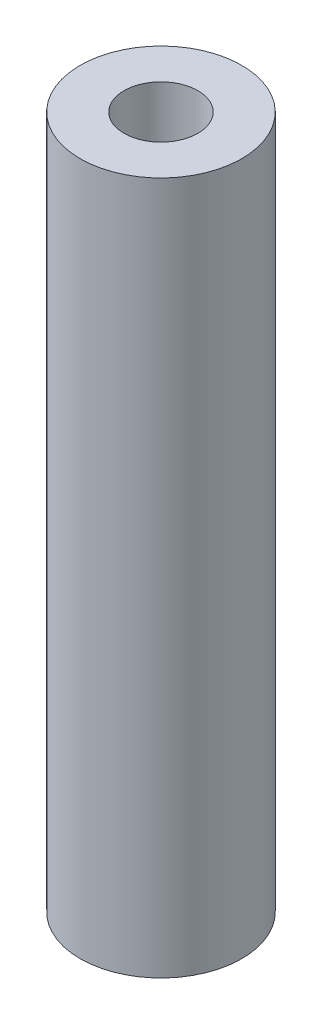
ISO-10303-21;
HEADER;
FILE_DESCRIPTION(('STEP AP214'),'2;1');
FILE_NAME('part.step','',(''),(''),'','','');
FILE_SCHEMA(('AUTOMOTIVE_DESIGN { 1 0 10303 214 1 1 1 1 }'));
ENDSEC;
DATA;
#1=APPLICATION_CONTEXT('core data for automotive mechanical design processes');
#2=APPLICATION_PROTOCOL_DEFINITION('international standard','automotive_design',2000,#1);
#3=PRODUCT_CONTEXT('',#1,'mechanical');
#4=PRODUCT('Part','Part','',(#3));
#5=PRODUCT_RELATED_PRODUCT_CATEGORY('part','',(#4));
#6=PRODUCT_DEFINITION_FORMATION('','',#4);
#7=PRODUCT_DEFINITION_CONTEXT('part definition',#1,'design');
#8=PRODUCT_DEFINITION('design','',#6,#7);
#9=PRODUCT_DEFINITION_SHAPE('','',#8);
#10=(LENGTH_UNIT() NAMED_UNIT(*) SI_UNIT(.MILLI.,.METRE.));
#11=(NAMED_UNIT(*) PLANE_ANGLE_UNIT() SI_UNIT($,.RADIAN.));
#12=(NAMED_UNIT(*) SI_UNIT($,.STERADIAN.) SOLID_ANGLE_UNIT());
#13=UNCERTAINTY_MEASURE_WITH_UNIT(LENGTH_MEASURE(1.E-05),#10,'distance_accuracy_value','');
#14=(GEOMETRIC_REPRESENTATION_CONTEXT(3) GLOBAL_UNCERTAINTY_ASSIGNED_CONTEXT((#13)) GLOBAL_UNIT_ASSIGNED_CONTEXT((#10,
#11,#12)) REPRESENTATION_CONTEXT('',''));
#15=CARTESIAN_POINT('',(0.,0.,0.));
#16=DIRECTION('',(0.,0.,1.));
#17=DIRECTION('',(1.,0.,0.));
#18=AXIS2_PLACEMENT_3D('',#15,#16,#17);
#19=CARTESIAN_POINT('',(0.,30.,0.));
#20=DIRECTION('',(0.,1.,0.));
#21=DIRECTION('',(0.,0.,1.));
#22=AXIS2_PLACEMENT_3D('',#19,#20,#21);
#23=PLANE('',#22);
#24=CARTESIAN_POINT('',(0.,30.,0.));
#25=DIRECTION('',(0.,1.,0.));
#26=DIRECTION('',(0.,0.,1.));
#27=AXIS2_PLACEMENT_3D('',#24,#25,#26);
#28=CIRCLE('',#27,3.5);
#29=CARTESIAN_POINT('',(0.,30.,3.5));
#30=VERTEX_POINT('',#29);
#31=EDGE_CURVE('E10',#30,#30,#28,.T.);
#32=ORIENTED_EDGE('',*,*,#31,.T.);
#33=EDGE_LOOP('',(#32));
#34=FACE_BOUND('',#33,.T.);
#35=CARTESIAN_POINT('',(0.,30.,0.));
#36=DIRECTION('',(0.,1.,0.));
#37=DIRECTION('',(0.,0.,1.));
#38=AXIS2_PLACEMENT_3D('',#35,#36,#37);
#39=CIRCLE('',#38,1.6);
#40=CARTESIAN_POINT('',(0.,30.,1.6));
#41=VERTEX_POINT('',#40);
#42=EDGE_CURVE('E42',#41,#41,#39,.T.);
#43=ORIENTED_EDGE('',*,*,#42,.F.);
#44=EDGE_LOOP('',(#43));
#45=FACE_BOUND('',#44,.T.);
#46=ADVANCED_FACE('F31',(#34,#45),#23,.T.);
#47=CARTESIAN_POINT('',(0.,0.,0.));
#48=DIRECTION('',(0.,1.,0.));
#49=DIRECTION('',(0.,0.,1.));
#50=AXIS2_PLACEMENT_3D('',#47,#48,#49);
#51=PLANE('',#50);
#52=CARTESIAN_POINT('',(0.,0.,0.));
#53=DIRECTION('',(0.,1.,0.));
#54=DIRECTION('',(0.,0.,1.));
#55=AXIS2_PLACEMENT_3D('',#52,#53,#54);
#56=CIRCLE('',#55,3.5);
#57=CARTESIAN_POINT('',(0.,0.,3.5));
#58=VERTEX_POINT('',#57);
#59=EDGE_CURVE('E35',#58,#58,#56,.T.);
#60=ORIENTED_EDGE('',*,*,#59,.F.);
#61=EDGE_LOOP('',(#60));
#62=FACE_BOUND('',#61,.T.);
#63=CARTESIAN_POINT('',(0.,0.,0.));
#64=DIRECTION('',(0.,1.,0.));
#65=DIRECTION('',(0.,0.,1.));
#66=AXIS2_PLACEMENT_3D('',#63,#64,#65);
#67=CIRCLE('',#66,1.6);
#68=CARTESIAN_POINT('',(0.,0.,1.6));
#69=VERTEX_POINT('',#68);
#70=EDGE_CURVE('E44',#69,#69,#67,.T.);
#71=ORIENTED_EDGE('',*,*,#70,.T.);
#72=EDGE_LOOP('',(#71));
#73=FACE_BOUND('',#72,.T.);
#74=ADVANCED_FACE('F54',(#62,#73),#51,.F.);
#75=CARTESIAN_POINT('',(0.,30.,0.));
#76=DIRECTION('',(0.,-1.,0.));
#77=DIRECTION('',(0.,0.,-1.));
#78=AXIS2_PLACEMENT_3D('',#75,#76,#77);
#79=CYLINDRICAL_SURFACE('',#78,3.5);
#80=ORIENTED_EDGE('',*,*,#31,.F.);
#81=EDGE_LOOP('',(#80));
#82=FACE_BOUND('',#81,.T.);
#83=ORIENTED_EDGE('',*,*,#59,.T.);
#84=EDGE_LOOP('',(#83));
#85=FACE_BOUND('',#84,.T.);
#86=ADVANCED_FACE('F33',(#82,#85),#79,.T.);
#87=CARTESIAN_POINT('',(0.,30.,0.));
#88=DIRECTION('',(0.,-1.,0.));
#89=DIRECTION('',(0.,0.,-1.));
#90=AXIS2_PLACEMENT_3D('',#87,#88,#89);
#91=CYLINDRICAL_SURFACE('',#90,1.6);
#92=ORIENTED_EDGE('',*,*,#42,.T.);
#93=EDGE_LOOP('',(#92));
#94=FACE_BOUND('',#93,.T.);
#95=ORIENTED_EDGE('',*,*,#70,.F.);
#96=EDGE_LOOP('',(#95));
#97=FACE_BOUND('',#96,.T.);
#98=ADVANCED_FACE('F50',(#94,#97),#91,.F.);
#99=CLOSED_SHELL('',(#46,#74,#86,#98));
#100=MANIFOLD_SOLID_BREP('B2',#99);
#101=ADVANCED_BREP_SHAPE_REPRESENTATION('',(#18,#100),#14);
#102=SHAPE_DEFINITION_REPRESENTATION(#9,#101);
ENDSEC;
END-ISO-10303-21;
